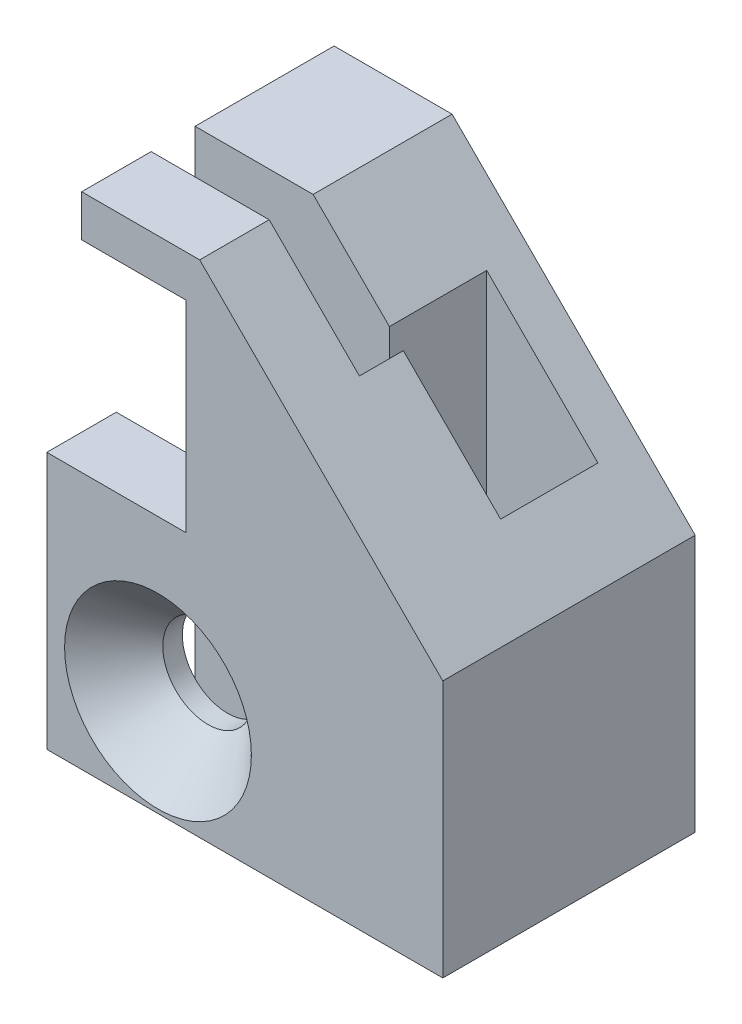
ISO-10303-21;
HEADER;
FILE_DESCRIPTION(('STEP AP214'),'2;1');
FILE_NAME('part.step','',(''),(''),'','','');
FILE_SCHEMA(('AUTOMOTIVE_DESIGN { 1 0 10303 214 1 1 1 1 }'));
ENDSEC;
DATA;
#1=APPLICATION_CONTEXT('core data for automotive mechanical design processes');
#2=APPLICATION_PROTOCOL_DEFINITION('international standard','automotive_design',2000,#1);
#3=PRODUCT_CONTEXT('',#1,'mechanical');
#4=PRODUCT('Part','Part','',(#3));
#5=PRODUCT_RELATED_PRODUCT_CATEGORY('part','',(#4));
#6=PRODUCT_DEFINITION_FORMATION('','',#4);
#7=PRODUCT_DEFINITION_CONTEXT('part definition',#1,'design');
#8=PRODUCT_DEFINITION('design','',#6,#7);
#9=PRODUCT_DEFINITION_SHAPE('','',#8);
#10=(LENGTH_UNIT() NAMED_UNIT(*) SI_UNIT(.MILLI.,.METRE.));
#11=(NAMED_UNIT(*) PLANE_ANGLE_UNIT() SI_UNIT($,.RADIAN.));
#12=(NAMED_UNIT(*) SI_UNIT($,.STERADIAN.) SOLID_ANGLE_UNIT());
#13=UNCERTAINTY_MEASURE_WITH_UNIT(LENGTH_MEASURE(1.E-05),#10,'distance_accuracy_value','');
#14=(GEOMETRIC_REPRESENTATION_CONTEXT(3) GLOBAL_UNCERTAINTY_ASSIGNED_CONTEXT((#13)) GLOBAL_UNIT_ASSIGNED_CONTEXT((#10,
#11,#12)) REPRESENTATION_CONTEXT('',''));
#15=CARTESIAN_POINT('',(0.,0.,0.));
#16=DIRECTION('',(0.,0.,1.));
#17=DIRECTION('',(1.,0.,0.));
#18=AXIS2_PLACEMENT_3D('',#15,#16,#17);
#19=CARTESIAN_POINT('',(0.,0.,-1.58));
#20=DIRECTION('',(0.,0.,1.));
#21=DIRECTION('',(1.,0.,0.));
#22=AXIS2_PLACEMENT_3D('',#19,#20,#21);
#23=PLANE('',#22);
#24=DIRECTION('',(-1.,0.,0.));
#25=VECTOR('',#24,1.);
#26=CARTESIAN_POINT('',(-121.99984,-73.999935,-1.58));
#27=LINE('',#26,#25);
#28=CARTESIAN_POINT('',(-115.254539470003,-73.999935,-1.58));
#29=VERTEX_POINT('',#28);
#30=CARTESIAN_POINT('',(-118.754539470003,-73.999935,-1.58));
#31=VERTEX_POINT('',#30);
#32=EDGE_CURVE('E322',#29,#31,#27,.T.);
#33=ORIENTED_EDGE('',*,*,#32,.T.);
#34=DIRECTION('',(0.,-1.,0.));
#35=VECTOR('',#34,1.);
#36=CARTESIAN_POINT('',(-118.754539470003,-55.999935,-1.58));
#37=LINE('',#36,#35);
#38=CARTESIAN_POINT('',(-118.754539470003,-59.2452355299967,-1.58));
#39=VERTEX_POINT('',#38);
#40=EDGE_CURVE('E254',#39,#31,#37,.T.);
#41=ORIENTED_EDGE('',*,*,#40,.F.);
#42=DIRECTION('',(0.707106781186548,-0.707106781186548,0.));
#43=VECTOR('',#42,1.);
#44=CARTESIAN_POINT('',(-113.254539470003,-64.7452355299967,-1.58));
#45=LINE('',#44,#43);
#46=CARTESIAN_POINT('',(-115.254539470003,-62.7452355299967,-1.58));
#47=VERTEX_POINT('',#46);
#48=EDGE_CURVE('E320',#39,#47,#45,.T.);
#49=ORIENTED_EDGE('',*,*,#48,.T.);
#50=DIRECTION('',(0.,1.,0.));
#51=VECTOR('',#50,1.);
#52=CARTESIAN_POINT('',(-115.254539470003,-62.7452355299967,-1.58));
#53=LINE('',#52,#51);
#54=EDGE_CURVE('E308',#29,#47,#53,.T.);
#55=ORIENTED_EDGE('',*,*,#54,.F.);
#56=EDGE_LOOP('',(#33,#41,#49,#55));
#57=FACE_BOUND('',#56,.T.);
#58=ADVANCED_FACE('F33',(#57),#23,.F.);
#59=CARTESIAN_POINT('',(0.,0.,0.));
#60=DIRECTION('',(0.,0.,1.));
#61=DIRECTION('',(1.,0.,0.));
#62=AXIS2_PLACEMENT_3D('',#59,#60,#61);
#63=PLANE('',#62);
#64=CARTESIAN_POINT('',(-123.49984,-70.499935,0.));
#65=DIRECTION('',(0.,0.,1.));
#66=DIRECTION('',(1.,0.,0.));
#67=AXIS2_PLACEMENT_3D('',#64,#65,#66);
#68=CIRCLE('',#67,1.625);
#69=CARTESIAN_POINT('',(-121.87484,-70.499935,0.));
#70=VERTEX_POINT('',#69);
#71=EDGE_CURVE('E325',#70,#70,#68,.T.);
#72=ORIENTED_EDGE('',*,*,#71,.T.);
#73=EDGE_LOOP('',(#72));
#74=FACE_BOUND('',#73,.T.);
#75=DIRECTION('',(-1.,0.,0.));
#76=VECTOR('',#75,1.);
#77=CARTESIAN_POINT('',(-121.99984,-55.999935,0.));
#78=LINE('',#77,#76);
#79=CARTESIAN_POINT('',(-121.99984,-55.999935,0.));
#80=VERTEX_POINT('',#79);
#81=CARTESIAN_POINT('',(-126.245140529997,-55.999935,0.));
#82=VERTEX_POINT('',#81);
#83=EDGE_CURVE('E350',#80,#82,#78,.T.);
#84=ORIENTED_EDGE('',*,*,#83,.F.);
#85=DIRECTION('',(-0.707106781186548,0.707106781186548,0.));
#86=VECTOR('',#85,1.);
#87=CARTESIAN_POINT('',(-113.254539470003,-64.7452355299967,0.));
#88=LINE('',#87,#86);
#89=CARTESIAN_POINT('',(-118.754539470003,-59.2452355299967,0.));
#90=VERTEX_POINT('',#89);
#91=EDGE_CURVE('E348',#90,#80,#88,.T.);
#92=ORIENTED_EDGE('',*,*,#91,.F.);
#93=DIRECTION('',(0.,-1.,0.));
#94=VECTOR('',#93,1.);
#95=CARTESIAN_POINT('',(-118.754539470003,-55.999935,0.));
#96=LINE('',#95,#94);
#97=CARTESIAN_POINT('',(-118.754539470003,-73.999935,0.));
#98=VERTEX_POINT('',#97);
#99=EDGE_CURVE('E255',#90,#98,#96,.T.);
#100=ORIENTED_EDGE('',*,*,#99,.T.);
#101=DIRECTION('',(1.,0.,0.));
#102=VECTOR('',#101,1.);
#103=CARTESIAN_POINT('',(-126.245140529997,-73.999935,0.));
#104=LINE('',#103,#102);
#105=CARTESIAN_POINT('',(-127.49984,-73.999935,0.));
#106=VERTEX_POINT('',#105);
#107=EDGE_CURVE('E328',#106,#98,#104,.T.);
#108=ORIENTED_EDGE('',*,*,#107,.F.);
#109=DIRECTION('',(0.,-1.,0.));
#110=VECTOR('',#109,1.);
#111=CARTESIAN_POINT('',(-127.49984,-73.999935,0.));
#112=LINE('',#111,#110);
#113=CARTESIAN_POINT('',(-127.49984,-64.7452355299967,0.));
#114=VERTEX_POINT('',#113);
#115=EDGE_CURVE('E239',#114,#106,#112,.T.);
#116=ORIENTED_EDGE('',*,*,#115,.F.);
#117=DIRECTION('',(-1.,0.,0.));
#118=VECTOR('',#117,1.);
#119=CARTESIAN_POINT('',(-126.245140529997,-64.7452355299967,0.));
#120=LINE('',#119,#118);
#121=CARTESIAN_POINT('',(-122.495140529997,-64.7452355299967,0.));
#122=VERTEX_POINT('',#121);
#123=EDGE_CURVE('E332',#122,#114,#120,.T.);
#124=ORIENTED_EDGE('',*,*,#123,.F.);
#125=DIRECTION('',(0.,-1.,0.));
#126=VECTOR('',#125,1.);
#127=CARTESIAN_POINT('',(-122.495140529997,-57.499935,0.));
#128=LINE('',#127,#126);
#129=CARTESIAN_POINT('',(-122.495140529997,-57.499935,0.));
#130=VERTEX_POINT('',#129);
#131=EDGE_CURVE('E356',#130,#122,#128,.T.);
#132=ORIENTED_EDGE('',*,*,#131,.F.);
#133=DIRECTION('',(1.,0.,0.));
#134=VECTOR('',#133,1.);
#135=CARTESIAN_POINT('',(-126.245140529997,-57.499935,0.));
#136=LINE('',#135,#134);
#137=CARTESIAN_POINT('',(-126.245140529997,-57.499935,0.));
#138=VERTEX_POINT('',#137);
#139=EDGE_CURVE('E354',#138,#130,#136,.T.);
#140=ORIENTED_EDGE('',*,*,#139,.F.);
#141=DIRECTION('',(0.,-1.,0.));
#142=VECTOR('',#141,1.);
#143=CARTESIAN_POINT('',(-126.245140529997,-55.999935,0.));
#144=LINE('',#143,#142);
#145=EDGE_CURVE('E352',#82,#138,#144,.T.);
#146=ORIENTED_EDGE('',*,*,#145,.F.);
#147=EDGE_LOOP('',(#84,#92,#100,#108,#116,#124,#132,#140,#146));
#148=FACE_BOUND('',#147,.T.);
#149=ADVANCED_FACE('F389',(#74,#148),#63,.F.);
#150=CARTESIAN_POINT('',(0.,0.,2.5));
#151=DIRECTION('',(0.,0.,1.));
#152=DIRECTION('',(1.,0.,0.));
#153=AXIS2_PLACEMENT_3D('',#150,#151,#152);
#154=PLANE('',#153);
#155=CARTESIAN_POINT('',(-123.49984,-70.499935,2.5));
#156=DIRECTION('',(0.,0.,1.));
#157=DIRECTION('',(1.,0.,0.));
#158=AXIS2_PLACEMENT_3D('',#155,#156,#157);
#159=CIRCLE('',#158,3.35997123);
#160=CARTESIAN_POINT('',(-120.13986877,-70.499935,2.5));
#161=VERTEX_POINT('',#160);
#162=EDGE_CURVE('E235',#161,#161,#159,.T.);
#163=ORIENTED_EDGE('',*,*,#162,.F.);
#164=EDGE_LOOP('',(#163));
#165=FACE_BOUND('',#164,.T.);
#166=DIRECTION('',(-1.,0.,0.));
#167=VECTOR('',#166,1.);
#168=CARTESIAN_POINT('',(-126.245140529997,-64.7452355299967,2.5));
#169=LINE('',#168,#167);
#170=CARTESIAN_POINT('',(-122.495140529997,-64.7452355299967,2.5));
#171=VERTEX_POINT('',#170);
#172=CARTESIAN_POINT('',(-127.49984,-64.7452355299967,2.5));
#173=VERTEX_POINT('',#172);
#174=EDGE_CURVE('E344',#171,#173,#169,.T.);
#175=ORIENTED_EDGE('',*,*,#174,.T.);
#176=DIRECTION('',(0.,-1.,0.));
#177=VECTOR('',#176,1.);
#178=CARTESIAN_POINT('',(-127.49984,-73.999935,2.5));
#179=LINE('',#178,#177);
#180=CARTESIAN_POINT('',(-127.49984,-73.999935,2.5));
#181=VERTEX_POINT('',#180);
#182=EDGE_CURVE('E243',#173,#181,#179,.T.);
#183=ORIENTED_EDGE('',*,*,#182,.T.);
#184=DIRECTION('',(1.,0.,0.));
#185=VECTOR('',#184,1.);
#186=CARTESIAN_POINT('',(-126.245140529997,-73.999935,2.5));
#187=LINE('',#186,#185);
#188=CARTESIAN_POINT('',(-113.254539470003,-73.999935,2.5));
#189=VERTEX_POINT('',#188);
#190=EDGE_CURVE('E329',#181,#189,#187,.T.);
#191=ORIENTED_EDGE('',*,*,#190,.T.);
#192=DIRECTION('',(0.,1.,0.));
#193=VECTOR('',#192,1.);
#194=CARTESIAN_POINT('',(-113.254539470003,-73.999935,2.5));
#195=LINE('',#194,#193);
#196=CARTESIAN_POINT('',(-113.254539470003,-64.7452355299967,2.5));
#197=VERTEX_POINT('',#196);
#198=EDGE_CURVE('E331',#189,#197,#195,.T.);
#199=ORIENTED_EDGE('',*,*,#198,.T.);
#200=DIRECTION('',(-0.707106781186548,0.707106781186548,0.));
#201=VECTOR('',#200,1.);
#202=CARTESIAN_POINT('',(-113.254539470003,-64.7452355299967,2.5));
#203=LINE('',#202,#201);
#204=CARTESIAN_POINT('',(-121.99984,-55.999935,2.5));
#205=VERTEX_POINT('',#204);
#206=EDGE_CURVE('E334',#197,#205,#203,.T.);
#207=ORIENTED_EDGE('',*,*,#206,.T.);
#208=DIRECTION('',(-1.,0.,0.));
#209=VECTOR('',#208,1.);
#210=CARTESIAN_POINT('',(-121.99984,-55.999935,2.5));
#211=LINE('',#210,#209);
#212=CARTESIAN_POINT('',(-126.245140529997,-55.999935,2.5));
#213=VERTEX_POINT('',#212);
#214=EDGE_CURVE('E336',#205,#213,#211,.T.);
#215=ORIENTED_EDGE('',*,*,#214,.T.);
#216=DIRECTION('',(0.,-1.,0.));
#217=VECTOR('',#216,1.);
#218=CARTESIAN_POINT('',(-126.245140529997,-55.999935,2.5));
#219=LINE('',#218,#217);
#220=CARTESIAN_POINT('',(-126.245140529997,-57.499935,2.5));
#221=VERTEX_POINT('',#220);
#222=EDGE_CURVE('E338',#213,#221,#219,.T.);
#223=ORIENTED_EDGE('',*,*,#222,.T.);
#224=DIRECTION('',(1.,0.,0.));
#225=VECTOR('',#224,1.);
#226=CARTESIAN_POINT('',(-126.245140529997,-57.499935,2.5));
#227=LINE('',#226,#225);
#228=CARTESIAN_POINT('',(-122.495140529997,-57.499935,2.5));
#229=VERTEX_POINT('',#228);
#230=EDGE_CURVE('E340',#221,#229,#227,.T.);
#231=ORIENTED_EDGE('',*,*,#230,.T.);
#232=DIRECTION('',(0.,-1.,0.));
#233=VECTOR('',#232,1.);
#234=CARTESIAN_POINT('',(-122.495140529997,-57.499935,2.5));
#235=LINE('',#234,#233);
#236=EDGE_CURVE('E342',#229,#171,#235,.T.);
#237=ORIENTED_EDGE('',*,*,#236,.T.);
#238=EDGE_LOOP('',(#175,#183,#191,#199,#207,#215,#223,#231,#237));
#239=FACE_BOUND('',#238,.T.);
#240=ADVANCED_FACE('F392',(#165,#239),#154,.T.);
#241=CARTESIAN_POINT('',(-126.245140529997,-73.999935,2.5));
#242=DIRECTION('',(0.,1.,0.));
#243=DIRECTION('',(0.,0.,1.));
#244=AXIS2_PLACEMENT_3D('',#241,#242,#243);
#245=PLANE('',#244);
#246=DIRECTION('',(-1.,0.,0.));
#247=VECTOR('',#246,1.);
#248=CARTESIAN_POINT('',(-124.071416766498,-73.999935,-4.08));
#249=LINE('',#248,#247);
#250=CARTESIAN_POINT('',(-124.071416766498,-73.999935,-4.08));
#251=VERTEX_POINT('',#250);
#252=CARTESIAN_POINT('',(-126.245140529997,-73.999935,-4.08));
#253=VERTEX_POINT('',#252);
#254=EDGE_CURVE('E218',#251,#253,#249,.T.);
#255=ORIENTED_EDGE('',*,*,#254,.F.);
#256=DIRECTION('',(0.,0.,-1.));
#257=VECTOR('',#256,1.);
#258=CARTESIAN_POINT('',(-124.071416766498,-73.999935,-4.08));
#259=LINE('',#258,#257);
#260=CARTESIAN_POINT('',(-124.071416766498,-73.999935,-6.58));
#261=VERTEX_POINT('',#260);
#262=EDGE_CURVE('E231',#251,#261,#259,.T.);
#263=ORIENTED_EDGE('',*,*,#262,.T.);
#264=DIRECTION('',(-1.,0.,0.));
#265=VECTOR('',#264,1.);
#266=CARTESIAN_POINT('',(-113.254539470003,-73.999935,-6.58));
#267=LINE('',#266,#265);
#268=CARTESIAN_POINT('',(-113.254539470003,-73.999935,-6.58));
#269=VERTEX_POINT('',#268);
#270=EDGE_CURVE('E263',#269,#261,#267,.T.);
#271=ORIENTED_EDGE('',*,*,#270,.F.);
#272=DIRECTION('',(0.,0.,-1.));
#273=VECTOR('',#272,1.);
#274=CARTESIAN_POINT('',(-113.254539470003,-73.999935,2.5));
#275=LINE('',#274,#273);
#276=EDGE_CURVE('E42',#189,#269,#275,.T.);
#277=ORIENTED_EDGE('',*,*,#276,.F.);
#278=ORIENTED_EDGE('',*,*,#190,.F.);
#279=DIRECTION('',(0.,0.,1.));
#280=VECTOR('',#279,1.);
#281=CARTESIAN_POINT('',(-127.49984,-73.999935,0.));
#282=LINE('',#281,#280);
#283=EDGE_CURVE('E246',#106,#181,#282,.T.);
#284=ORIENTED_EDGE('',*,*,#283,.F.);
#285=ORIENTED_EDGE('',*,*,#107,.T.);
#286=DIRECTION('',(0.,0.,1.));
#287=VECTOR('',#286,1.);
#288=CARTESIAN_POINT('',(-118.754539470003,-73.999935,-1.58));
#289=LINE('',#288,#287);
#290=EDGE_CURVE('E249',#31,#98,#289,.T.);
#291=ORIENTED_EDGE('',*,*,#290,.F.);
#292=ORIENTED_EDGE('',*,*,#32,.F.);
#293=DIRECTION('',(0.,0.,1.));
#294=VECTOR('',#293,1.);
#295=CARTESIAN_POINT('',(-115.254539470003,-73.999935,-5.08));
#296=LINE('',#295,#294);
#297=CARTESIAN_POINT('',(-115.254539470003,-73.999935,-5.08));
#298=VERTEX_POINT('',#297);
#299=EDGE_CURVE('E317',#298,#29,#296,.T.);
#300=ORIENTED_EDGE('',*,*,#299,.F.);
#301=DIRECTION('',(-1.,0.,0.));
#302=VECTOR('',#301,1.);
#303=CARTESIAN_POINT('',(-113.254539470003,-73.999935,-5.08));
#304=LINE('',#303,#302);
#305=CARTESIAN_POINT('',(-119.254539470003,-73.999935,-5.08));
#306=VERTEX_POINT('',#305);
#307=EDGE_CURVE('E258',#298,#306,#304,.T.);
#308=ORIENTED_EDGE('',*,*,#307,.T.);
#309=DIRECTION('',(0.,0.,1.));
#310=VECTOR('',#309,1.);
#311=CARTESIAN_POINT('',(-119.254539470003,-73.999935,-5.08));
#312=LINE('',#311,#310);
#313=CARTESIAN_POINT('',(-119.254539470003,-73.999935,-1.58));
#314=VERTEX_POINT('',#313);
#315=EDGE_CURVE('E302',#306,#314,#312,.T.);
#316=ORIENTED_EDGE('',*,*,#315,.T.);
#317=DIRECTION('',(-1.,0.,0.));
#318=VECTOR('',#317,1.);
#319=CARTESIAN_POINT('',(-121.99984,-73.999935,-1.58));
#320=LINE('',#319,#318);
#321=CARTESIAN_POINT('',(-126.245140529997,-73.999935,-1.58));
#322=VERTEX_POINT('',#321);
#323=EDGE_CURVE('E58',#314,#322,#320,.T.);
#324=ORIENTED_EDGE('',*,*,#323,.T.);
#325=DIRECTION('',(0.,0.,1.));
#326=VECTOR('',#325,1.);
#327=CARTESIAN_POINT('',(-126.245140529997,-73.999935,-5.08));
#328=LINE('',#327,#326);
#329=EDGE_CURVE('E300',#253,#322,#328,.T.);
#330=ORIENTED_EDGE('',*,*,#329,.F.);
#331=EDGE_LOOP('',(#255,#263,#271,#277,#278,#284,#285,#291,#292,#300,#308,#316,#324,#330));
#332=FACE_BOUND('',#331,.T.);
#333=ADVANCED_FACE('F35',(#332),#245,.F.);
#334=CARTESIAN_POINT('',(-113.254539470003,-73.999935,2.5));
#335=DIRECTION('',(-1.,0.,0.));
#336=DIRECTION('',(0.,0.,1.));
#337=AXIS2_PLACEMENT_3D('',#334,#335,#336);
#338=PLANE('',#337);
#339=ORIENTED_EDGE('',*,*,#276,.T.);
#340=DIRECTION('',(0.,-1.,0.));
#341=VECTOR('',#340,1.);
#342=CARTESIAN_POINT('',(-113.254539470003,-64.7452355299967,-6.58));
#343=LINE('',#342,#341);
#344=CARTESIAN_POINT('',(-113.254539470003,-64.7452355299967,-6.58));
#345=VERTEX_POINT('',#344);
#346=EDGE_CURVE('E260',#345,#269,#343,.T.);
#347=ORIENTED_EDGE('',*,*,#346,.F.);
#348=DIRECTION('',(0.,0.,-1.));
#349=VECTOR('',#348,1.);
#350=CARTESIAN_POINT('',(-113.254539470003,-64.7452355299967,2.5));
#351=LINE('',#350,#349);
#352=EDGE_CURVE('E373',#197,#345,#351,.T.);
#353=ORIENTED_EDGE('',*,*,#352,.F.);
#354=ORIENTED_EDGE('',*,*,#198,.F.);
#355=EDGE_LOOP('',(#339,#347,#353,#354));
#356=FACE_BOUND('',#355,.T.);
#357=ADVANCED_FACE('F451',(#356),#338,.F.);
#358=CARTESIAN_POINT('',(-113.254539470003,-64.7452355299967,2.5));
#359=DIRECTION('',(-0.707106781186548,-0.707106781186548,0.));
#360=DIRECTION('',(0.707106781186548,-0.707106781186548,0.));
#361=AXIS2_PLACEMENT_3D('',#358,#359,#360);
#362=PLANE('',#361);
#363=DIRECTION('',(0.,0.,1.));
#364=VECTOR('',#363,1.);
#365=CARTESIAN_POINT('',(-118.754539470003,-59.2452355299967,2.5));
#366=LINE('',#365,#364);
#367=EDGE_CURVE('E11',#39,#90,#366,.T.);
#368=ORIENTED_EDGE('',*,*,#367,.T.);
#369=ORIENTED_EDGE('',*,*,#91,.T.);
#370=DIRECTION('',(0.,0.,-1.));
#371=VECTOR('',#370,1.);
#372=CARTESIAN_POINT('',(-121.99984,-55.999935,2.5));
#373=LINE('',#372,#371);
#374=EDGE_CURVE('E370',#205,#80,#373,.T.);
#375=ORIENTED_EDGE('',*,*,#374,.F.);
#376=ORIENTED_EDGE('',*,*,#206,.F.);
#377=ORIENTED_EDGE('',*,*,#352,.T.);
#378=DIRECTION('',(0.707106781186548,-0.707106781186548,0.));
#379=VECTOR('',#378,1.);
#380=CARTESIAN_POINT('',(-121.99984,-55.999935,-6.58));
#381=LINE('',#380,#379);
#382=CARTESIAN_POINT('',(-121.99984,-55.999935,-6.58));
#383=VERTEX_POINT('',#382);
#384=EDGE_CURVE('E272',#383,#345,#381,.T.);
#385=ORIENTED_EDGE('',*,*,#384,.F.);
#386=DIRECTION('',(0.,0.,1.));
#387=VECTOR('',#386,1.);
#388=CARTESIAN_POINT('',(-121.99984,-55.999935,-5.08));
#389=LINE('',#388,#387);
#390=CARTESIAN_POINT('',(-121.99984,-55.999935,-1.58));
#391=VERTEX_POINT('',#390);
#392=EDGE_CURVE('E286',#383,#391,#389,.T.);
#393=ORIENTED_EDGE('',*,*,#392,.T.);
#394=DIRECTION('',(0.707106781186547,-0.707106781186547,0.));
#395=VECTOR('',#394,1.);
#396=CARTESIAN_POINT('',(-121.99984,-55.999935,-1.58));
#397=LINE('',#396,#395);
#398=CARTESIAN_POINT('',(-119.254539470003,-58.7452355299967,-1.58));
#399=VERTEX_POINT('',#398);
#400=EDGE_CURVE('E287',#391,#399,#397,.T.);
#401=ORIENTED_EDGE('',*,*,#400,.T.);
#402=DIRECTION('',(0.,0.,1.));
#403=VECTOR('',#402,1.);
#404=CARTESIAN_POINT('',(-119.254539470003,-58.7452355299967,-5.08));
#405=LINE('',#404,#403);
#406=CARTESIAN_POINT('',(-119.254539470003,-58.7452355299967,-5.08));
#407=VERTEX_POINT('',#406);
#408=EDGE_CURVE('E305',#407,#399,#405,.T.);
#409=ORIENTED_EDGE('',*,*,#408,.F.);
#410=DIRECTION('',(0.707106781186548,-0.707106781186548,0.));
#411=VECTOR('',#410,1.);
#412=CARTESIAN_POINT('',(-121.99984,-55.999935,-5.08));
#413=LINE('',#412,#411);
#414=CARTESIAN_POINT('',(-115.254539470003,-62.7452355299967,-5.08));
#415=VERTEX_POINT('',#414);
#416=EDGE_CURVE('E264',#407,#415,#413,.T.);
#417=ORIENTED_EDGE('',*,*,#416,.T.);
#418=DIRECTION('',(0.,0.,1.));
#419=VECTOR('',#418,1.);
#420=CARTESIAN_POINT('',(-115.254539470003,-62.7452355299967,-5.08));
#421=LINE('',#420,#419);
#422=EDGE_CURVE('E312',#415,#47,#421,.T.);
#423=ORIENTED_EDGE('',*,*,#422,.T.);
#424=ORIENTED_EDGE('',*,*,#48,.F.);
#425=EDGE_LOOP('',(#368,#369,#375,#376,#377,#385,#393,#401,#409,#417,#423,#424));
#426=FACE_BOUND('',#425,.T.);
#427=ADVANCED_FACE('F414',(#426),#362,.F.);
#428=CARTESIAN_POINT('',(-121.99984,-55.999935,2.5));
#429=DIRECTION('',(0.,-1.,0.));
#430=DIRECTION('',(0.,0.,-1.));
#431=AXIS2_PLACEMENT_3D('',#428,#429,#430);
#432=PLANE('',#431);
#433=ORIENTED_EDGE('',*,*,#83,.T.);
#434=DIRECTION('',(0.,0.,-1.));
#435=VECTOR('',#434,1.);
#436=CARTESIAN_POINT('',(-126.245140529997,-55.999935,2.5));
#437=LINE('',#436,#435);
#438=EDGE_CURVE('E367',#213,#82,#437,.T.);
#439=ORIENTED_EDGE('',*,*,#438,.F.);
#440=ORIENTED_EDGE('',*,*,#214,.F.);
#441=ORIENTED_EDGE('',*,*,#374,.T.);
#442=EDGE_LOOP('',(#433,#439,#440,#441));
#443=FACE_BOUND('',#442,.T.);
#444=ADVANCED_FACE('F400',(#443),#432,.F.);
#445=CARTESIAN_POINT('',(-126.245140529997,-55.999935,2.5));
#446=DIRECTION('',(1.,0.,0.));
#447=DIRECTION('',(0.,0.,-1.));
#448=AXIS2_PLACEMENT_3D('',#445,#446,#447);
#449=PLANE('',#448);
#450=ORIENTED_EDGE('',*,*,#145,.T.);
#451=DIRECTION('',(0.,0.,-1.));
#452=VECTOR('',#451,1.);
#453=CARTESIAN_POINT('',(-126.245140529997,-57.499935,2.5));
#454=LINE('',#453,#452);
#455=EDGE_CURVE('E364',#221,#138,#454,.T.);
#456=ORIENTED_EDGE('',*,*,#455,.F.);
#457=ORIENTED_EDGE('',*,*,#222,.F.);
#458=ORIENTED_EDGE('',*,*,#438,.T.);
#459=EDGE_LOOP('',(#450,#456,#457,#458));
#460=FACE_BOUND('',#459,.T.);
#461=ADVANCED_FACE('F405',(#460),#449,.F.);
#462=CARTESIAN_POINT('',(-126.245140529997,-57.499935,2.5));
#463=DIRECTION('',(0.,1.,0.));
#464=DIRECTION('',(0.,0.,1.));
#465=AXIS2_PLACEMENT_3D('',#462,#463,#464);
#466=PLANE('',#465);
#467=ORIENTED_EDGE('',*,*,#139,.T.);
#468=DIRECTION('',(0.,0.,-1.));
#469=VECTOR('',#468,1.);
#470=CARTESIAN_POINT('',(-122.495140529997,-57.499935,2.5));
#471=LINE('',#470,#469);
#472=EDGE_CURVE('E361',#229,#130,#471,.T.);
#473=ORIENTED_EDGE('',*,*,#472,.F.);
#474=ORIENTED_EDGE('',*,*,#230,.F.);
#475=ORIENTED_EDGE('',*,*,#455,.T.);
#476=EDGE_LOOP('',(#467,#473,#474,#475));
#477=FACE_BOUND('',#476,.T.);
#478=ADVANCED_FACE('F486',(#477),#466,.F.);
#479=CARTESIAN_POINT('',(-122.495140529997,-57.499935,2.5));
#480=DIRECTION('',(1.,0.,0.));
#481=DIRECTION('',(0.,0.,-1.));
#482=AXIS2_PLACEMENT_3D('',#479,#480,#481);
#483=PLANE('',#482);
#484=ORIENTED_EDGE('',*,*,#131,.T.);
#485=DIRECTION('',(0.,0.,-1.));
#486=VECTOR('',#485,1.);
#487=CARTESIAN_POINT('',(-122.495140529997,-64.7452355299967,2.5));
#488=LINE('',#487,#486);
#489=EDGE_CURVE('E346',#171,#122,#488,.T.);
#490=ORIENTED_EDGE('',*,*,#489,.F.);
#491=ORIENTED_EDGE('',*,*,#236,.F.);
#492=ORIENTED_EDGE('',*,*,#472,.T.);
#493=EDGE_LOOP('',(#484,#490,#491,#492));
#494=FACE_BOUND('',#493,.T.);
#495=ADVANCED_FACE('F482',(#494),#483,.F.);
#496=CARTESIAN_POINT('',(-126.245140529997,-64.7452355299967,2.5));
#497=DIRECTION('',(0.,-1.,0.));
#498=DIRECTION('',(0.,0.,-1.));
#499=AXIS2_PLACEMENT_3D('',#496,#497,#498);
#500=PLANE('',#499);
#501=ORIENTED_EDGE('',*,*,#123,.T.);
#502=DIRECTION('',(0.,0.,1.));
#503=VECTOR('',#502,1.);
#504=CARTESIAN_POINT('',(-127.49984,-64.7452355299967,0.));
#505=LINE('',#504,#503);
#506=EDGE_CURVE('E242',#114,#173,#505,.T.);
#507=ORIENTED_EDGE('',*,*,#506,.T.);
#508=ORIENTED_EDGE('',*,*,#174,.F.);
#509=ORIENTED_EDGE('',*,*,#489,.T.);
#510=EDGE_LOOP('',(#501,#507,#508,#509));
#511=FACE_BOUND('',#510,.T.);
#512=ADVANCED_FACE('F385',(#511),#500,.F.);
#513=CARTESIAN_POINT('',(-123.49984,-70.499935,2.5));
#514=DIRECTION('',(0.,0.,-1.));
#515=DIRECTION('',(-1.,0.,0.));
#516=AXIS2_PLACEMENT_3D('',#513,#514,#515);
#517=CYLINDRICAL_SURFACE('',#516,1.625);
#518=CARTESIAN_POINT('',(-123.49984,-70.499935,0.703384697780503));
#519=DIRECTION('',(0.,0.,1.));
#520=DIRECTION('',(1.,0.,0.));
#521=AXIS2_PLACEMENT_3D('',#518,#519,#520);
#522=CIRCLE('',#521,1.625);
#523=CARTESIAN_POINT('',(-121.87484,-70.499935,0.703384697780503));
#524=VERTEX_POINT('',#523);
#525=EDGE_CURVE('E238',#524,#524,#522,.F.);
#526=ORIENTED_EDGE('',*,*,#525,.F.);
#527=EDGE_LOOP('',(#526));
#528=FACE_BOUND('',#527,.T.);
#529=ORIENTED_EDGE('',*,*,#71,.F.);
#530=EDGE_LOOP('',(#529));
#531=FACE_BOUND('',#530,.T.);
#532=ADVANCED_FACE('F381',(#528,#531),#517,.F.);
#533=CARTESIAN_POINT('',(-115.254539470003,-62.7452355299967,-5.08));
#534=DIRECTION('',(1.,0.,0.));
#535=DIRECTION('',(0.,0.,-1.));
#536=AXIS2_PLACEMENT_3D('',#533,#534,#535);
#537=PLANE('',#536);
#538=ORIENTED_EDGE('',*,*,#54,.T.);
#539=ORIENTED_EDGE('',*,*,#422,.F.);
#540=DIRECTION('',(0.,1.,0.));
#541=VECTOR('',#540,1.);
#542=CARTESIAN_POINT('',(-115.254539470003,-62.7452355299967,-5.08));
#543=LINE('',#542,#541);
#544=EDGE_CURVE('E309',#298,#415,#543,.T.);
#545=ORIENTED_EDGE('',*,*,#544,.F.);
#546=ORIENTED_EDGE('',*,*,#299,.T.);
#547=EDGE_LOOP('',(#538,#539,#545,#546));
#548=FACE_BOUND('',#547,.T.);
#549=ADVANCED_FACE('F384',(#548),#537,.F.);
#550=CARTESIAN_POINT('',(0.,0.,-1.58));
#551=DIRECTION('',(0.,0.,-1.));
#552=DIRECTION('',(-1.,0.,0.));
#553=AXIS2_PLACEMENT_3D('',#550,#551,#552);
#554=PLANE('',#553);
#555=CARTESIAN_POINT('',(-123.49984,-70.499935,-1.58));
#556=DIRECTION('',(0.,0.,-1.));
#557=DIRECTION('',(-1.,0.,0.));
#558=AXIS2_PLACEMENT_3D('',#555,#556,#557);
#559=CIRCLE('',#558,1.625);
#560=CARTESIAN_POINT('',(-125.12484,-70.499935,-1.58));
#561=VERTEX_POINT('',#560);
#562=EDGE_CURVE('E275',#561,#561,#559,.T.);
#563=ORIENTED_EDGE('',*,*,#562,.T.);
#564=EDGE_LOOP('',(#563));
#565=FACE_BOUND('',#564,.T.);
#566=ORIENTED_EDGE('',*,*,#323,.F.);
#567=DIRECTION('',(0.,-1.,0.));
#568=VECTOR('',#567,1.);
#569=CARTESIAN_POINT('',(-119.254539470003,-73.999935,-1.58));
#570=LINE('',#569,#568);
#571=EDGE_CURVE('E282',#399,#314,#570,.T.);
#572=ORIENTED_EDGE('',*,*,#571,.F.);
#573=ORIENTED_EDGE('',*,*,#400,.F.);
#574=DIRECTION('',(1.,0.,0.));
#575=VECTOR('',#574,1.);
#576=CARTESIAN_POINT('',(-126.245140529997,-55.999935,-1.58));
#577=LINE('',#576,#575);
#578=CARTESIAN_POINT('',(-126.245140529997,-55.999935,-1.58));
#579=VERTEX_POINT('',#578);
#580=EDGE_CURVE('E292',#579,#391,#577,.T.);
#581=ORIENTED_EDGE('',*,*,#580,.F.);
#582=DIRECTION('',(0.,1.,0.));
#583=VECTOR('',#582,1.);
#584=CARTESIAN_POINT('',(-126.245140529997,-64.7452355299967,-1.58));
#585=LINE('',#584,#583);
#586=EDGE_CURVE('E290',#322,#579,#585,.T.);
#587=ORIENTED_EDGE('',*,*,#586,.F.);
#588=EDGE_LOOP('',(#566,#572,#573,#581,#587));
#589=FACE_BOUND('',#588,.T.);
#590=ADVANCED_FACE('F436',(#565,#589),#554,.F.);
#591=CARTESIAN_POINT('',(-119.254539470003,-73.999935,-5.08));
#592=DIRECTION('',(-1.,0.,0.));
#593=DIRECTION('',(0.,0.,1.));
#594=AXIS2_PLACEMENT_3D('',#591,#592,#593);
#595=PLANE('',#594);
#596=ORIENTED_EDGE('',*,*,#571,.T.);
#597=ORIENTED_EDGE('',*,*,#315,.F.);
#598=DIRECTION('',(0.,-1.,0.));
#599=VECTOR('',#598,1.);
#600=CARTESIAN_POINT('',(-119.254539470003,-73.999935,-5.08));
#601=LINE('',#600,#599);
#602=EDGE_CURVE('E283',#407,#306,#601,.T.);
#603=ORIENTED_EDGE('',*,*,#602,.F.);
#604=ORIENTED_EDGE('',*,*,#408,.T.);
#605=EDGE_LOOP('',(#596,#597,#603,#604));
#606=FACE_BOUND('',#605,.T.);
#607=ADVANCED_FACE('F433',(#606),#595,.F.);
#608=CARTESIAN_POINT('',(-126.245140529997,-64.7452355299967,-5.08));
#609=DIRECTION('',(1.,0.,0.));
#610=DIRECTION('',(0.,0.,-1.));
#611=AXIS2_PLACEMENT_3D('',#608,#609,#610);
#612=PLANE('',#611);
#613=DIRECTION('',(0.,1.,0.));
#614=VECTOR('',#613,1.);
#615=CARTESIAN_POINT('',(-126.245140529997,-73.999935,-6.58));
#616=LINE('',#615,#614);
#617=CARTESIAN_POINT('',(-126.245140529997,-68.914935,-6.58));
#618=VERTEX_POINT('',#617);
#619=CARTESIAN_POINT('',(-126.245140529997,-55.999935,-6.58));
#620=VERTEX_POINT('',#619);
#621=EDGE_CURVE('E267',#618,#620,#616,.T.);
#622=ORIENTED_EDGE('',*,*,#621,.F.);
#623=DIRECTION('',(0.,0.,-1.));
#624=VECTOR('',#623,1.);
#625=CARTESIAN_POINT('',(-126.245140529997,-68.914935,-4.08));
#626=LINE('',#625,#624);
#627=CARTESIAN_POINT('',(-126.245140529997,-68.914935,-4.08));
#628=VERTEX_POINT('',#627);
#629=EDGE_CURVE('E229',#628,#618,#626,.T.);
#630=ORIENTED_EDGE('',*,*,#629,.F.);
#631=DIRECTION('',(0.,1.,0.));
#632=VECTOR('',#631,1.);
#633=CARTESIAN_POINT('',(-126.245140529997,-73.999935,-4.08));
#634=LINE('',#633,#632);
#635=EDGE_CURVE('E220',#253,#628,#634,.T.);
#636=ORIENTED_EDGE('',*,*,#635,.F.);
#637=ORIENTED_EDGE('',*,*,#329,.T.);
#638=ORIENTED_EDGE('',*,*,#586,.T.);
#639=DIRECTION('',(0.,0.,1.));
#640=VECTOR('',#639,1.);
#641=CARTESIAN_POINT('',(-126.245140529997,-55.999935,-5.08));
#642=LINE('',#641,#640);
#643=EDGE_CURVE('E297',#620,#579,#642,.T.);
#644=ORIENTED_EDGE('',*,*,#643,.F.);
#645=EDGE_LOOP('',(#622,#630,#636,#637,#638,#644));
#646=FACE_BOUND('',#645,.T.);
#647=ADVANCED_FACE('F440',(#646),#612,.F.);
#648=CARTESIAN_POINT('',(-126.245140529997,-55.999935,-5.08));
#649=DIRECTION('',(0.,-1.,0.));
#650=DIRECTION('',(0.,0.,-1.));
#651=AXIS2_PLACEMENT_3D('',#648,#649,#650);
#652=PLANE('',#651);
#653=ORIENTED_EDGE('',*,*,#580,.T.);
#654=ORIENTED_EDGE('',*,*,#392,.F.);
#655=DIRECTION('',(1.,0.,0.));
#656=VECTOR('',#655,1.);
#657=CARTESIAN_POINT('',(-126.245140529997,-55.999935,-6.58));
#658=LINE('',#657,#656);
#659=EDGE_CURVE('E269',#620,#383,#658,.T.);
#660=ORIENTED_EDGE('',*,*,#659,.F.);
#661=ORIENTED_EDGE('',*,*,#643,.T.);
#662=EDGE_LOOP('',(#653,#654,#660,#661));
#663=FACE_BOUND('',#662,.T.);
#664=ADVANCED_FACE('F444',(#663),#652,.F.);
#665=CARTESIAN_POINT('',(-123.49984,-70.499935,-5.08));
#666=DIRECTION('',(0.,0.,1.));
#667=DIRECTION('',(1.,0.,0.));
#668=AXIS2_PLACEMENT_3D('',#665,#666,#667);
#669=CYLINDRICAL_SURFACE('',#668,1.625);
#670=CARTESIAN_POINT('',(-123.49984,-70.499935,-4.08));
#671=DIRECTION('',(0.,0.,1.));
#672=DIRECTION('',(1.,0.,0.));
#673=AXIS2_PLACEMENT_3D('',#670,#671,#672);
#674=CIRCLE('',#673,1.625);
#675=CARTESIAN_POINT('',(-121.87484,-70.499935,-4.08));
#676=VERTEX_POINT('',#675);
#677=EDGE_CURVE('E37',#676,#676,#674,.T.);
#678=ORIENTED_EDGE('',*,*,#677,.F.);
#679=EDGE_LOOP('',(#678));
#680=FACE_BOUND('',#679,.T.);
#681=ORIENTED_EDGE('',*,*,#562,.F.);
#682=EDGE_LOOP('',(#681));
#683=FACE_BOUND('',#682,.T.);
#684=ADVANCED_FACE('F587',(#680,#683),#669,.F.);
#685=CARTESIAN_POINT('',(0.,0.,-5.08));
#686=DIRECTION('',(0.,0.,-1.));
#687=DIRECTION('',(-1.,0.,0.));
#688=AXIS2_PLACEMENT_3D('',#685,#686,#687);
#689=PLANE('',#688);
#690=ORIENTED_EDGE('',*,*,#307,.F.);
#691=ORIENTED_EDGE('',*,*,#544,.T.);
#692=ORIENTED_EDGE('',*,*,#416,.F.);
#693=ORIENTED_EDGE('',*,*,#602,.T.);
#694=EDGE_LOOP('',(#690,#691,#692,#693));
#695=FACE_BOUND('',#694,.T.);
#696=ADVANCED_FACE('F429',(#695),#689,.F.);
#697=CARTESIAN_POINT('',(0.,0.,-6.58));
#698=DIRECTION('',(0.,0.,-1.));
#699=DIRECTION('',(-1.,0.,0.));
#700=AXIS2_PLACEMENT_3D('',#697,#698,#699);
#701=PLANE('',#700);
#702=DIRECTION('',(0.86602540378444,0.499999999999998,0.));
#703=VECTOR('',#702,1.);
#704=CARTESIAN_POINT('',(-123.49984,-67.329935,-6.58));
#705=LINE('',#704,#703);
#706=CARTESIAN_POINT('',(-123.49984,-67.329935,-6.58));
#707=VERTEX_POINT('',#706);
#708=EDGE_CURVE('E211',#618,#707,#705,.T.);
#709=ORIENTED_EDGE('',*,*,#708,.F.);
#710=ORIENTED_EDGE('',*,*,#621,.T.);
#711=ORIENTED_EDGE('',*,*,#659,.T.);
#712=ORIENTED_EDGE('',*,*,#384,.T.);
#713=ORIENTED_EDGE('',*,*,#346,.T.);
#714=ORIENTED_EDGE('',*,*,#270,.T.);
#715=DIRECTION('',(-0.866025403784432,-0.500000000000012,0.));
#716=VECTOR('',#715,1.);
#717=CARTESIAN_POINT('',(-123.49984,-73.669935,-6.58));
#718=LINE('',#717,#716);
#719=CARTESIAN_POINT('',(-120.754539470003,-72.084935,-6.58));
#720=VERTEX_POINT('',#719);
#721=EDGE_CURVE('E214',#720,#261,#718,.T.);
#722=ORIENTED_EDGE('',*,*,#721,.F.);
#723=DIRECTION('',(0.,-1.,0.));
#724=VECTOR('',#723,1.);
#725=CARTESIAN_POINT('',(-120.754539470003,-72.084935,-6.58));
#726=LINE('',#725,#724);
#727=CARTESIAN_POINT('',(-120.754539470003,-68.914935,-6.58));
#728=VERTEX_POINT('',#727);
#729=EDGE_CURVE('E224',#728,#720,#726,.T.);
#730=ORIENTED_EDGE('',*,*,#729,.F.);
#731=DIRECTION('',(0.866025403784439,-0.5,0.));
#732=VECTOR('',#731,1.);
#733=CARTESIAN_POINT('',(-120.754539470003,-68.914935,-6.58));
#734=LINE('',#733,#732);
#735=EDGE_CURVE('E50',#707,#728,#734,.T.);
#736=ORIENTED_EDGE('',*,*,#735,.F.);
#737=EDGE_LOOP('',(#709,#710,#711,#712,#713,#714,#722,#730,#736));
#738=FACE_BOUND('',#737,.T.);
#739=ADVANCED_FACE('F448',(#738),#701,.T.);
#740=CARTESIAN_POINT('',(-118.754539470003,-55.999935,-1.58));
#741=DIRECTION('',(1.,0.,0.));
#742=DIRECTION('',(0.,0.,-1.));
#743=AXIS2_PLACEMENT_3D('',#740,#741,#742);
#744=PLANE('',#743);
#745=ORIENTED_EDGE('',*,*,#40,.T.);
#746=ORIENTED_EDGE('',*,*,#290,.T.);
#747=ORIENTED_EDGE('',*,*,#99,.F.);
#748=ORIENTED_EDGE('',*,*,#367,.F.);
#749=EDGE_LOOP('',(#745,#746,#747,#748));
#750=FACE_BOUND('',#749,.T.);
#751=ADVANCED_FACE('F418',(#750),#744,.F.);
#752=CARTESIAN_POINT('',(-127.49984,-73.999935,0.));
#753=DIRECTION('',(-1.,0.,0.));
#754=DIRECTION('',(0.,0.,1.));
#755=AXIS2_PLACEMENT_3D('',#752,#753,#754);
#756=PLANE('',#755);
#757=ORIENTED_EDGE('',*,*,#182,.F.);
#758=ORIENTED_EDGE('',*,*,#506,.F.);
#759=ORIENTED_EDGE('',*,*,#115,.T.);
#760=ORIENTED_EDGE('',*,*,#283,.T.);
#761=EDGE_LOOP('',(#757,#758,#759,#760));
#762=FACE_BOUND('',#761,.T.);
#763=ADVANCED_FACE('F532',(#762),#756,.T.);
#764=CARTESIAN_POINT('',(-123.49984,-70.499935,2.5));
#765=DIRECTION('',(0.,0.,1.));
#766=DIRECTION('',(1.,0.,0.));
#767=AXIS2_PLACEMENT_3D('',#764,#765,#766);
#768=CONICAL_SURFACE('',#767,3.35997123,0.767944870877507);
#769=ORIENTED_EDGE('',*,*,#525,.T.);
#770=EDGE_LOOP('',(#769));
#771=FACE_BOUND('',#770,.T.);
#772=ORIENTED_EDGE('',*,*,#162,.T.);
#773=EDGE_LOOP('',(#772));
#774=FACE_BOUND('',#773,.T.);
#775=ADVANCED_FACE('F378',(#771,#774),#768,.F.);
#776=CARTESIAN_POINT('',(-120.754539470003,-68.914935,-4.08));
#777=DIRECTION('',(0.5,0.866025403784439,0.));
#778=DIRECTION('',(-0.866025403784439,0.5,0.));
#779=AXIS2_PLACEMENT_3D('',#776,#777,#778);
#780=PLANE('',#779);
#781=ORIENTED_EDGE('',*,*,#735,.T.);
#782=DIRECTION('',(0.,0.,-1.));
#783=VECTOR('',#782,1.);
#784=CARTESIAN_POINT('',(-120.754539470003,-68.914935,-4.08));
#785=LINE('',#784,#783);
#786=CARTESIAN_POINT('',(-120.754539470003,-68.914935,-4.08));
#787=VERTEX_POINT('',#786);
#788=EDGE_CURVE('E190',#787,#728,#785,.T.);
#789=ORIENTED_EDGE('',*,*,#788,.F.);
#790=DIRECTION('',(0.866025403784439,-0.5,0.));
#791=VECTOR('',#790,1.);
#792=CARTESIAN_POINT('',(-120.754539470003,-68.914935,-4.08));
#793=LINE('',#792,#791);
#794=CARTESIAN_POINT('',(-123.49984,-67.329935,-4.08));
#795=VERTEX_POINT('',#794);
#796=EDGE_CURVE('E194',#795,#787,#793,.T.);
#797=ORIENTED_EDGE('',*,*,#796,.F.);
#798=DIRECTION('',(0.,0.,-1.));
#799=VECTOR('',#798,1.);
#800=CARTESIAN_POINT('',(-123.49984,-67.329935,-4.08));
#801=LINE('',#800,#799);
#802=EDGE_CURVE('E227',#795,#707,#801,.T.);
#803=ORIENTED_EDGE('',*,*,#802,.T.);
#804=EDGE_LOOP('',(#781,#789,#797,#803));
#805=FACE_BOUND('',#804,.T.);
#806=ADVANCED_FACE('F192',(#805),#780,.F.);
#807=CARTESIAN_POINT('',(-123.49984,-67.329935,-4.08));
#808=DIRECTION('',(-0.499999999999998,0.86602540378444,0.));
#809=DIRECTION('',(-0.86602540378444,-0.499999999999998,0.));
#810=AXIS2_PLACEMENT_3D('',#807,#808,#809);
#811=PLANE('',#810);
#812=ORIENTED_EDGE('',*,*,#708,.T.);
#813=ORIENTED_EDGE('',*,*,#802,.F.);
#814=DIRECTION('',(0.86602540378444,0.499999999999998,0.));
#815=VECTOR('',#814,1.);
#816=CARTESIAN_POINT('',(-123.49984,-67.329935,-4.08));
#817=LINE('',#816,#815);
#818=EDGE_CURVE('E200',#628,#795,#817,.T.);
#819=ORIENTED_EDGE('',*,*,#818,.F.);
#820=ORIENTED_EDGE('',*,*,#629,.T.);
#821=EDGE_LOOP('',(#812,#813,#819,#820));
#822=FACE_BOUND('',#821,.T.);
#823=ADVANCED_FACE('F460',(#822),#811,.F.);
#824=CARTESIAN_POINT('',(-123.49984,-73.669935,-4.08));
#825=DIRECTION('',(0.500000000000012,-0.866025403784432,0.));
#826=DIRECTION('',(0.866025403784432,0.500000000000012,0.));
#827=AXIS2_PLACEMENT_3D('',#824,#825,#826);
#828=PLANE('',#827);
#829=ORIENTED_EDGE('',*,*,#721,.T.);
#830=ORIENTED_EDGE('',*,*,#262,.F.);
#831=DIRECTION('',(-0.866025403784439,-0.5,0.));
#832=VECTOR('',#831,1.);
#833=CARTESIAN_POINT('',(-120.754539470003,-72.084935,-4.08));
#834=LINE('',#833,#832);
#835=CARTESIAN_POINT('',(-120.754539470003,-72.084935,-4.08));
#836=VERTEX_POINT('',#835);
#837=EDGE_CURVE('E207',#836,#251,#834,.T.);
#838=ORIENTED_EDGE('',*,*,#837,.F.);
#839=DIRECTION('',(0.,0.,-1.));
#840=VECTOR('',#839,1.);
#841=CARTESIAN_POINT('',(-120.754539470003,-72.084935,-4.08));
#842=LINE('',#841,#840);
#843=EDGE_CURVE('E199',#836,#720,#842,.T.);
#844=ORIENTED_EDGE('',*,*,#843,.T.);
#845=EDGE_LOOP('',(#829,#830,#838,#844));
#846=FACE_BOUND('',#845,.T.);
#847=ADVANCED_FACE('F457',(#846),#828,.F.);
#848=CARTESIAN_POINT('',(-120.754539470003,-72.084935,-4.08));
#849=DIRECTION('',(1.,0.,0.));
#850=DIRECTION('',(0.,0.,-1.));
#851=AXIS2_PLACEMENT_3D('',#848,#849,#850);
#852=PLANE('',#851);
#853=ORIENTED_EDGE('',*,*,#729,.T.);
#854=ORIENTED_EDGE('',*,*,#843,.F.);
#855=DIRECTION('',(0.,-1.,0.));
#856=VECTOR('',#855,1.);
#857=CARTESIAN_POINT('',(-120.754539470003,-72.084935,-4.08));
#858=LINE('',#857,#856);
#859=EDGE_CURVE('E203',#787,#836,#858,.T.);
#860=ORIENTED_EDGE('',*,*,#859,.F.);
#861=ORIENTED_EDGE('',*,*,#788,.T.);
#862=EDGE_LOOP('',(#853,#854,#860,#861));
#863=FACE_BOUND('',#862,.T.);
#864=ADVANCED_FACE('F204',(#863),#852,.F.);
#865=CARTESIAN_POINT('',(0.,0.,-4.08));
#866=DIRECTION('',(0.,0.,1.));
#867=DIRECTION('',(1.,0.,0.));
#868=AXIS2_PLACEMENT_3D('',#865,#866,#867);
#869=PLANE('',#868);
#870=ORIENTED_EDGE('',*,*,#677,.T.);
#871=EDGE_LOOP('',(#870));
#872=FACE_BOUND('',#871,.T.);
#873=ORIENTED_EDGE('',*,*,#796,.T.);
#874=ORIENTED_EDGE('',*,*,#859,.T.);
#875=ORIENTED_EDGE('',*,*,#837,.T.);
#876=ORIENTED_EDGE('',*,*,#254,.T.);
#877=ORIENTED_EDGE('',*,*,#635,.T.);
#878=ORIENTED_EDGE('',*,*,#818,.T.);
#879=EDGE_LOOP('',(#873,#874,#875,#876,#877,#878));
#880=FACE_BOUND('',#879,.T.);
#881=ADVANCED_FACE('F209',(#872,#880),#869,.F.);
#882=CLOSED_SHELL('',(#58,#149,#240,#333,#357,#427,#444,#461,#478,#495,#512,#532,#549,#590,#607,
#647,#664,#684,#696,#739,#751,#763,#775,#806,#823,#847,#864,#881));
#883=MANIFOLD_SOLID_BREP('B2',#882);
#884=ADVANCED_BREP_SHAPE_REPRESENTATION('',(#18,#883),#14);
#885=SHAPE_DEFINITION_REPRESENTATION(#9,#884);
ENDSEC;
END-ISO-10303-21;
